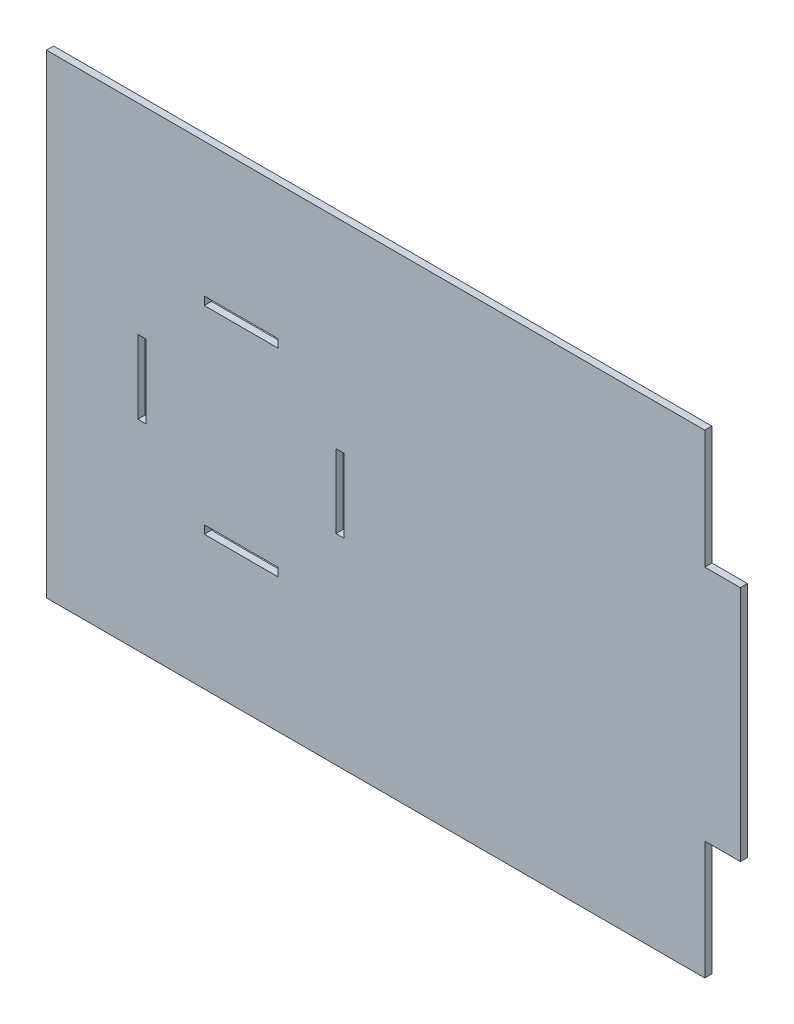
ISO-10303-21;
HEADER;
FILE_DESCRIPTION(('STEP AP214'),'2;1');
FILE_NAME('part.step','',(''),(''),'','','');
FILE_SCHEMA(('AUTOMOTIVE_DESIGN { 1 0 10303 214 1 1 1 1 }'));
ENDSEC;
DATA;
#1=APPLICATION_CONTEXT('core data for automotive mechanical design processes');
#2=APPLICATION_PROTOCOL_DEFINITION('international standard','automotive_design',2000,#1);
#3=PRODUCT_CONTEXT('',#1,'mechanical');
#4=PRODUCT('Part','Part','',(#3));
#5=PRODUCT_RELATED_PRODUCT_CATEGORY('part','',(#4));
#6=PRODUCT_DEFINITION_FORMATION('','',#4);
#7=PRODUCT_DEFINITION_CONTEXT('part definition',#1,'design');
#8=PRODUCT_DEFINITION('design','',#6,#7);
#9=PRODUCT_DEFINITION_SHAPE('','',#8);
#10=(LENGTH_UNIT() NAMED_UNIT(*) SI_UNIT(.MILLI.,.METRE.));
#11=(NAMED_UNIT(*) PLANE_ANGLE_UNIT() SI_UNIT($,.RADIAN.));
#12=(NAMED_UNIT(*) SI_UNIT($,.STERADIAN.) SOLID_ANGLE_UNIT());
#13=UNCERTAINTY_MEASURE_WITH_UNIT(LENGTH_MEASURE(1.E-05),#10,'distance_accuracy_value','');
#14=(GEOMETRIC_REPRESENTATION_CONTEXT(3) GLOBAL_UNCERTAINTY_ASSIGNED_CONTEXT((#13)) GLOBAL_UNIT_ASSIGNED_CONTEXT((#10,
#11,#12)) REPRESENTATION_CONTEXT('',''));
#15=CARTESIAN_POINT('',(0.,0.,0.));
#16=DIRECTION('',(0.,0.,1.));
#17=DIRECTION('',(1.,0.,0.));
#18=AXIS2_PLACEMENT_3D('',#15,#16,#17);
#19=CARTESIAN_POINT('',(-277.5,100.,3.));
#20=DIRECTION('',(0.,-1.,0.));
#21=DIRECTION('',(0.,0.,-1.));
#22=AXIS2_PLACEMENT_3D('',#19,#20,#21);
#23=PLANE('',#22);
#24=DIRECTION('',(-1.,0.,0.));
#25=VECTOR('',#24,1.);
#26=CARTESIAN_POINT('',(-277.5,100.,3.));
#27=LINE('',#26,#25);
#28=CARTESIAN_POINT('',(0.,100.,3.));
#29=VERTEX_POINT('',#28);
#30=CARTESIAN_POINT('',(-277.5,100.,3.));
#31=VERTEX_POINT('',#30);
#32=EDGE_CURVE('E213',#29,#31,#27,.T.);
#33=ORIENTED_EDGE('',*,*,#32,.F.);
#34=DIRECTION('',(0.,0.,1.));
#35=VECTOR('',#34,1.);
#36=CARTESIAN_POINT('',(0.,100.,0.));
#37=LINE('',#36,#35);
#38=CARTESIAN_POINT('',(0.,100.,0.));
#39=VERTEX_POINT('',#38);
#40=EDGE_CURVE('E202',#39,#29,#37,.T.);
#41=ORIENTED_EDGE('',*,*,#40,.F.);
#42=DIRECTION('',(-1.,0.,0.));
#43=VECTOR('',#42,1.);
#44=CARTESIAN_POINT('',(-277.5,100.,0.));
#45=LINE('',#44,#43);
#46=CARTESIAN_POINT('',(-277.5,100.,0.));
#47=VERTEX_POINT('',#46);
#48=EDGE_CURVE('E212',#39,#47,#45,.T.);
#49=ORIENTED_EDGE('',*,*,#48,.T.);
#50=DIRECTION('',(0.,0.,-1.));
#51=VECTOR('',#50,1.);
#52=CARTESIAN_POINT('',(-277.5,100.,3.));
#53=LINE('',#52,#51);
#54=EDGE_CURVE('E11',#31,#47,#53,.T.);
#55=ORIENTED_EDGE('',*,*,#54,.F.);
#56=EDGE_LOOP('',(#33,#41,#49,#55));
#57=FACE_BOUND('',#56,.T.);
#58=ADVANCED_FACE('F39',(#57),#23,.F.);
#59=CARTESIAN_POINT('',(-277.5,-100.,3.));
#60=DIRECTION('',(1.,0.,0.));
#61=DIRECTION('',(0.,0.,-1.));
#62=AXIS2_PLACEMENT_3D('',#59,#60,#61);
#63=PLANE('',#62);
#64=DIRECTION('',(0.,-1.,0.));
#65=VECTOR('',#64,1.);
#66=CARTESIAN_POINT('',(-277.5,-100.,0.));
#67=LINE('',#66,#65);
#68=CARTESIAN_POINT('',(-277.5,-100.,0.));
#69=VERTEX_POINT('',#68);
#70=EDGE_CURVE('E221',#47,#69,#67,.T.);
#71=ORIENTED_EDGE('',*,*,#70,.T.);
#72=DIRECTION('',(0.,0.,-1.));
#73=VECTOR('',#72,1.);
#74=CARTESIAN_POINT('',(-277.5,-100.,3.));
#75=LINE('',#74,#73);
#76=CARTESIAN_POINT('',(-277.5,-100.,3.));
#77=VERTEX_POINT('',#76);
#78=EDGE_CURVE('E46',#77,#69,#75,.T.);
#79=ORIENTED_EDGE('',*,*,#78,.F.);
#80=DIRECTION('',(0.,-1.,0.));
#81=VECTOR('',#80,1.);
#82=CARTESIAN_POINT('',(-277.5,-100.,3.));
#83=LINE('',#82,#81);
#84=EDGE_CURVE('E238',#31,#77,#83,.T.);
#85=ORIENTED_EDGE('',*,*,#84,.F.);
#86=ORIENTED_EDGE('',*,*,#54,.T.);
#87=EDGE_LOOP('',(#71,#79,#85,#86));
#88=FACE_BOUND('',#87,.T.);
#89=ADVANCED_FACE('F410',(#88),#63,.F.);
#90=CARTESIAN_POINT('',(-277.5,-100.,3.));
#91=DIRECTION('',(0.,1.,0.));
#92=DIRECTION('',(0.,0.,1.));
#93=AXIS2_PLACEMENT_3D('',#90,#91,#92);
#94=PLANE('',#93);
#95=DIRECTION('',(1.,0.,0.));
#96=VECTOR('',#95,1.);
#97=CARTESIAN_POINT('',(-277.5,-100.,0.));
#98=LINE('',#97,#96);
#99=CARTESIAN_POINT('',(0.,-100.,0.));
#100=VERTEX_POINT('',#99);
#101=EDGE_CURVE('E224',#69,#100,#98,.T.);
#102=ORIENTED_EDGE('',*,*,#101,.T.);
#103=DIRECTION('',(0.,0.,1.));
#104=VECTOR('',#103,1.);
#105=CARTESIAN_POINT('',(0.,-100.,0.));
#106=LINE('',#105,#104);
#107=CARTESIAN_POINT('',(0.,-100.,3.));
#108=VERTEX_POINT('',#107);
#109=EDGE_CURVE('E333',#100,#108,#106,.T.);
#110=ORIENTED_EDGE('',*,*,#109,.T.);
#111=DIRECTION('',(1.,0.,0.));
#112=VECTOR('',#111,1.);
#113=CARTESIAN_POINT('',(-277.5,-100.,3.));
#114=LINE('',#113,#112);
#115=EDGE_CURVE('E229',#77,#108,#114,.T.);
#116=ORIENTED_EDGE('',*,*,#115,.F.);
#117=ORIENTED_EDGE('',*,*,#78,.T.);
#118=EDGE_LOOP('',(#102,#110,#116,#117));
#119=FACE_BOUND('',#118,.T.);
#120=ADVANCED_FACE('F407',(#119),#94,.F.);
#121=CARTESIAN_POINT('',(0.,0.,3.));
#122=DIRECTION('',(0.,0.,-1.));
#123=DIRECTION('',(-1.,0.,0.));
#124=AXIS2_PLACEMENT_3D('',#121,#122,#123);
#125=PLANE('',#124);
#126=DIRECTION('',(1.,0.,0.));
#127=VECTOR('',#126,1.);
#128=CARTESIAN_POINT('',(-211.,40.,3.));
#129=LINE('',#128,#127);
#130=CARTESIAN_POINT('',(-211.,40.,3.));
#131=VERTEX_POINT('',#130);
#132=CARTESIAN_POINT('',(-180.,40.,3.));
#133=VERTEX_POINT('',#132);
#134=EDGE_CURVE('E322',#131,#133,#129,.T.);
#135=ORIENTED_EDGE('',*,*,#134,.F.);
#136=DIRECTION('',(0.,-1.,0.));
#137=VECTOR('',#136,1.);
#138=CARTESIAN_POINT('',(-211.,43.5,3.));
#139=LINE('',#138,#137);
#140=CARTESIAN_POINT('',(-211.,43.5,3.));
#141=VERTEX_POINT('',#140);
#142=EDGE_CURVE('E61',#141,#131,#139,.T.);
#143=ORIENTED_EDGE('',*,*,#142,.F.);
#144=DIRECTION('',(-1.,0.,0.));
#145=VECTOR('',#144,1.);
#146=CARTESIAN_POINT('',(-211.,43.5,3.));
#147=LINE('',#146,#145);
#148=CARTESIAN_POINT('',(-180.,43.5,3.));
#149=VERTEX_POINT('',#148);
#150=EDGE_CURVE('E309',#149,#141,#147,.T.);
#151=ORIENTED_EDGE('',*,*,#150,.F.);
#152=DIRECTION('',(0.,1.,0.));
#153=VECTOR('',#152,1.);
#154=CARTESIAN_POINT('',(-180.,43.5,3.));
#155=LINE('',#154,#153);
#156=EDGE_CURVE('E325',#133,#149,#155,.T.);
#157=ORIENTED_EDGE('',*,*,#156,.F.);
#158=EDGE_LOOP('',(#135,#143,#151,#157));
#159=FACE_BOUND('',#158,.T.);
#160=DIRECTION('',(-1.,0.,0.));
#161=VECTOR('',#160,1.);
#162=CARTESIAN_POINT('',(-211.,-40.,3.));
#163=LINE('',#162,#161);
#164=CARTESIAN_POINT('',(-180.,-40.,3.));
#165=VERTEX_POINT('',#164);
#166=CARTESIAN_POINT('',(-211.,-40.,3.));
#167=VERTEX_POINT('',#166);
#168=EDGE_CURVE('E353',#165,#167,#163,.T.);
#169=ORIENTED_EDGE('',*,*,#168,.F.);
#170=DIRECTION('',(0.,1.,0.));
#171=VECTOR('',#170,1.);
#172=CARTESIAN_POINT('',(-180.,-43.5,3.));
#173=LINE('',#172,#171);
#174=CARTESIAN_POINT('',(-180.,-43.5,3.));
#175=VERTEX_POINT('',#174);
#176=EDGE_CURVE('E272',#175,#165,#173,.T.);
#177=ORIENTED_EDGE('',*,*,#176,.F.);
#178=DIRECTION('',(1.,0.,0.));
#179=VECTOR('',#178,1.);
#180=CARTESIAN_POINT('',(-211.,-43.5,3.));
#181=LINE('',#180,#179);
#182=CARTESIAN_POINT('',(-211.,-43.5,3.));
#183=VERTEX_POINT('',#182);
#184=EDGE_CURVE('E341',#183,#175,#181,.T.);
#185=ORIENTED_EDGE('',*,*,#184,.F.);
#186=DIRECTION('',(0.,-1.,0.));
#187=VECTOR('',#186,1.);
#188=CARTESIAN_POINT('',(-211.,-43.5,3.));
#189=LINE('',#188,#187);
#190=EDGE_CURVE('E356',#167,#183,#189,.T.);
#191=ORIENTED_EDGE('',*,*,#190,.F.);
#192=EDGE_LOOP('',(#169,#177,#185,#191));
#193=FACE_BOUND('',#192,.T.);
#194=DIRECTION('',(-1.,0.,0.));
#195=VECTOR('',#194,1.);
#196=CARTESIAN_POINT('',(-239.,15.5,3.));
#197=LINE('',#196,#195);
#198=CARTESIAN_POINT('',(-235.5,15.5,3.));
#199=VERTEX_POINT('',#198);
#200=CARTESIAN_POINT('',(-239.,15.5,3.));
#201=VERTEX_POINT('',#200);
#202=EDGE_CURVE('E261',#199,#201,#197,.T.);
#203=ORIENTED_EDGE('',*,*,#202,.F.);
#204=DIRECTION('',(0.,1.,0.));
#205=VECTOR('',#204,1.);
#206=CARTESIAN_POINT('',(-235.5,-15.5,3.));
#207=LINE('',#206,#205);
#208=CARTESIAN_POINT('',(-235.5,-15.5,3.));
#209=VERTEX_POINT('',#208);
#210=EDGE_CURVE('E258',#209,#199,#207,.T.);
#211=ORIENTED_EDGE('',*,*,#210,.F.);
#212=DIRECTION('',(1.,0.,0.));
#213=VECTOR('',#212,1.);
#214=CARTESIAN_POINT('',(-239.,-15.5,3.));
#215=LINE('',#214,#213);
#216=CARTESIAN_POINT('',(-239.,-15.5,3.));
#217=VERTEX_POINT('',#216);
#218=EDGE_CURVE('E247',#217,#209,#215,.T.);
#219=ORIENTED_EDGE('',*,*,#218,.F.);
#220=DIRECTION('',(0.,-1.,0.));
#221=VECTOR('',#220,1.);
#222=CARTESIAN_POINT('',(-239.,-15.5,3.));
#223=LINE('',#222,#221);
#224=EDGE_CURVE('E264',#201,#217,#223,.T.);
#225=ORIENTED_EDGE('',*,*,#224,.F.);
#226=EDGE_LOOP('',(#203,#211,#219,#225));
#227=FACE_BOUND('',#226,.T.);
#228=DIRECTION('',(-1.,0.,0.));
#229=VECTOR('',#228,1.);
#230=CARTESIAN_POINT('',(-155.5,15.4999999999999,3.));
#231=LINE('',#230,#229);
#232=CARTESIAN_POINT('',(-152.,15.4999999999999,3.));
#233=VERTEX_POINT('',#232);
#234=CARTESIAN_POINT('',(-155.5,15.4999999999999,3.));
#235=VERTEX_POINT('',#234);
#236=EDGE_CURVE('E226',#233,#235,#231,.T.);
#237=ORIENTED_EDGE('',*,*,#236,.F.);
#238=DIRECTION('',(0.,1.,0.));
#239=VECTOR('',#238,1.);
#240=CARTESIAN_POINT('',(-152.,-15.5000000000001,3.));
#241=LINE('',#240,#239);
#242=CARTESIAN_POINT('',(-152.,-15.5000000000001,3.));
#243=VERTEX_POINT('',#242);
#244=EDGE_CURVE('E222',#243,#233,#241,.T.);
#245=ORIENTED_EDGE('',*,*,#244,.F.);
#246=DIRECTION('',(1.,0.,0.));
#247=VECTOR('',#246,1.);
#248=CARTESIAN_POINT('',(-155.5,-15.5000000000001,3.));
#249=LINE('',#248,#247);
#250=CARTESIAN_POINT('',(-155.5,-15.5000000000001,3.));
#251=VERTEX_POINT('',#250);
#252=EDGE_CURVE('E281',#251,#243,#249,.T.);
#253=ORIENTED_EDGE('',*,*,#252,.F.);
#254=DIRECTION('',(0.,-1.,0.));
#255=VECTOR('',#254,1.);
#256=CARTESIAN_POINT('',(-155.5,-15.5000000000001,3.));
#257=LINE('',#256,#255);
#258=EDGE_CURVE('E294',#235,#251,#257,.T.);
#259=ORIENTED_EDGE('',*,*,#258,.F.);
#260=EDGE_LOOP('',(#237,#245,#253,#259));
#261=FACE_BOUND('',#260,.T.);
#262=ORIENTED_EDGE('',*,*,#115,.T.);
#263=DIRECTION('',(0.,-1.,0.));
#264=VECTOR('',#263,1.);
#265=CARTESIAN_POINT('',(0.,-50.,3.));
#266=LINE('',#265,#264);
#267=CARTESIAN_POINT('',(0.,-50.,3.));
#268=VERTEX_POINT('',#267);
#269=EDGE_CURVE('E207',#268,#108,#266,.T.);
#270=ORIENTED_EDGE('',*,*,#269,.F.);
#271=DIRECTION('',(-1.,0.,0.));
#272=VECTOR('',#271,1.);
#273=CARTESIAN_POINT('',(0.,-50.,3.));
#274=LINE('',#273,#272);
#275=CARTESIAN_POINT('',(15.,-50.,3.));
#276=VERTEX_POINT('',#275);
#277=EDGE_CURVE('E378',#276,#268,#274,.T.);
#278=ORIENTED_EDGE('',*,*,#277,.F.);
#279=DIRECTION('',(0.,-1.,0.));
#280=VECTOR('',#279,1.);
#281=CARTESIAN_POINT('',(15.,-50.,3.));
#282=LINE('',#281,#280);
#283=CARTESIAN_POINT('',(15.,50.,3.));
#284=VERTEX_POINT('',#283);
#285=EDGE_CURVE('E381',#284,#276,#282,.T.);
#286=ORIENTED_EDGE('',*,*,#285,.F.);
#287=DIRECTION('',(1.,0.,0.));
#288=VECTOR('',#287,1.);
#289=CARTESIAN_POINT('',(15.,50.,3.));
#290=LINE('',#289,#288);
#291=CARTESIAN_POINT('',(0.,50.,3.));
#292=VERTEX_POINT('',#291);
#293=EDGE_CURVE('E384',#292,#284,#290,.T.);
#294=ORIENTED_EDGE('',*,*,#293,.F.);
#295=DIRECTION('',(0.,-1.,0.));
#296=VECTOR('',#295,1.);
#297=CARTESIAN_POINT('',(0.,100.,3.));
#298=LINE('',#297,#296);
#299=EDGE_CURVE('E387',#29,#292,#298,.T.);
#300=ORIENTED_EDGE('',*,*,#299,.F.);
#301=ORIENTED_EDGE('',*,*,#32,.T.);
#302=ORIENTED_EDGE('',*,*,#84,.T.);
#303=EDGE_LOOP('',(#262,#270,#278,#286,#294,#300,#301,#302));
#304=FACE_BOUND('',#303,.T.);
#305=ADVANCED_FACE('F409',(#159,#193,#227,#261,#304),#125,.F.);
#306=CARTESIAN_POINT('',(0.,0.,0.));
#307=DIRECTION('',(0.,0.,-1.));
#308=DIRECTION('',(-1.,0.,0.));
#309=AXIS2_PLACEMENT_3D('',#306,#307,#308);
#310=PLANE('',#309);
#311=DIRECTION('',(0.,-1.,0.));
#312=VECTOR('',#311,1.);
#313=CARTESIAN_POINT('',(0.,-50.,0.));
#314=LINE('',#313,#312);
#315=CARTESIAN_POINT('',(0.,-50.,0.));
#316=VERTEX_POINT('',#315);
#317=EDGE_CURVE('E214',#316,#100,#314,.T.);
#318=ORIENTED_EDGE('',*,*,#317,.T.);
#319=ORIENTED_EDGE('',*,*,#101,.F.);
#320=ORIENTED_EDGE('',*,*,#70,.F.);
#321=ORIENTED_EDGE('',*,*,#48,.F.);
#322=DIRECTION('',(0.,-1.,0.));
#323=VECTOR('',#322,1.);
#324=CARTESIAN_POINT('',(0.,100.,0.));
#325=LINE('',#324,#323);
#326=CARTESIAN_POINT('',(0.,50.,0.));
#327=VERTEX_POINT('',#326);
#328=EDGE_CURVE('E198',#39,#327,#325,.T.);
#329=ORIENTED_EDGE('',*,*,#328,.T.);
#330=DIRECTION('',(1.,0.,0.));
#331=VECTOR('',#330,1.);
#332=CARTESIAN_POINT('',(15.,50.,0.));
#333=LINE('',#332,#331);
#334=CARTESIAN_POINT('',(15.,50.,0.));
#335=VERTEX_POINT('',#334);
#336=EDGE_CURVE('E53',#327,#335,#333,.T.);
#337=ORIENTED_EDGE('',*,*,#336,.T.);
#338=DIRECTION('',(0.,-1.,0.));
#339=VECTOR('',#338,1.);
#340=CARTESIAN_POINT('',(15.,-50.,0.));
#341=LINE('',#340,#339);
#342=CARTESIAN_POINT('',(15.,-50.,0.));
#343=VERTEX_POINT('',#342);
#344=EDGE_CURVE('E393',#335,#343,#341,.T.);
#345=ORIENTED_EDGE('',*,*,#344,.T.);
#346=DIRECTION('',(-1.,0.,0.));
#347=VECTOR('',#346,1.);
#348=CARTESIAN_POINT('',(0.,-50.,0.));
#349=LINE('',#348,#347);
#350=EDGE_CURVE('E390',#343,#316,#349,.T.);
#351=ORIENTED_EDGE('',*,*,#350,.T.);
#352=EDGE_LOOP('',(#318,#319,#320,#321,#329,#337,#345,#351));
#353=FACE_BOUND('',#352,.T.);
#354=DIRECTION('',(0.,-1.,0.));
#355=VECTOR('',#354,1.);
#356=CARTESIAN_POINT('',(-211.,43.5,0.));
#357=LINE('',#356,#355);
#358=CARTESIAN_POINT('',(-211.,43.5,0.));
#359=VERTEX_POINT('',#358);
#360=CARTESIAN_POINT('',(-211.,40.,0.));
#361=VERTEX_POINT('',#360);
#362=EDGE_CURVE('E306',#359,#361,#357,.T.);
#363=ORIENTED_EDGE('',*,*,#362,.T.);
#364=DIRECTION('',(1.,0.,0.));
#365=VECTOR('',#364,1.);
#366=CARTESIAN_POINT('',(-211.,40.,0.));
#367=LINE('',#366,#365);
#368=CARTESIAN_POINT('',(-180.,40.,0.));
#369=VERTEX_POINT('',#368);
#370=EDGE_CURVE('E310',#361,#369,#367,.T.);
#371=ORIENTED_EDGE('',*,*,#370,.T.);
#372=DIRECTION('',(0.,1.,0.));
#373=VECTOR('',#372,1.);
#374=CARTESIAN_POINT('',(-180.,43.5,0.));
#375=LINE('',#374,#373);
#376=CARTESIAN_POINT('',(-180.,43.5,0.));
#377=VERTEX_POINT('',#376);
#378=EDGE_CURVE('E313',#369,#377,#375,.T.);
#379=ORIENTED_EDGE('',*,*,#378,.T.);
#380=DIRECTION('',(-1.,0.,0.));
#381=VECTOR('',#380,1.);
#382=CARTESIAN_POINT('',(-211.,43.5,0.));
#383=LINE('',#382,#381);
#384=EDGE_CURVE('E316',#377,#359,#383,.T.);
#385=ORIENTED_EDGE('',*,*,#384,.T.);
#386=EDGE_LOOP('',(#363,#371,#379,#385));
#387=FACE_BOUND('',#386,.T.);
#388=DIRECTION('',(0.,1.,0.));
#389=VECTOR('',#388,1.);
#390=CARTESIAN_POINT('',(-180.,-43.5,0.));
#391=LINE('',#390,#389);
#392=CARTESIAN_POINT('',(-180.,-43.5,0.));
#393=VERTEX_POINT('',#392);
#394=CARTESIAN_POINT('',(-180.,-40.,0.));
#395=VERTEX_POINT('',#394);
#396=EDGE_CURVE('E338',#393,#395,#391,.T.);
#397=ORIENTED_EDGE('',*,*,#396,.T.);
#398=DIRECTION('',(-1.,0.,0.));
#399=VECTOR('',#398,1.);
#400=CARTESIAN_POINT('',(-211.,-40.,0.));
#401=LINE('',#400,#399);
#402=CARTESIAN_POINT('',(-211.,-40.,0.));
#403=VERTEX_POINT('',#402);
#404=EDGE_CURVE('E342',#395,#403,#401,.T.);
#405=ORIENTED_EDGE('',*,*,#404,.T.);
#406=DIRECTION('',(0.,-1.,0.));
#407=VECTOR('',#406,1.);
#408=CARTESIAN_POINT('',(-211.,-43.5,0.));
#409=LINE('',#408,#407);
#410=CARTESIAN_POINT('',(-211.,-43.5,0.));
#411=VERTEX_POINT('',#410);
#412=EDGE_CURVE('E345',#403,#411,#409,.T.);
#413=ORIENTED_EDGE('',*,*,#412,.T.);
#414=DIRECTION('',(1.,0.,0.));
#415=VECTOR('',#414,1.);
#416=CARTESIAN_POINT('',(-211.,-43.5,0.));
#417=LINE('',#416,#415);
#418=EDGE_CURVE('E348',#411,#393,#417,.T.);
#419=ORIENTED_EDGE('',*,*,#418,.T.);
#420=EDGE_LOOP('',(#397,#405,#413,#419));
#421=FACE_BOUND('',#420,.T.);
#422=DIRECTION('',(0.,1.,0.));
#423=VECTOR('',#422,1.);
#424=CARTESIAN_POINT('',(-235.5,-15.5,0.));
#425=LINE('',#424,#423);
#426=CARTESIAN_POINT('',(-235.5,-15.5,0.));
#427=VERTEX_POINT('',#426);
#428=CARTESIAN_POINT('',(-235.5,15.5,0.));
#429=VERTEX_POINT('',#428);
#430=EDGE_CURVE('E244',#427,#429,#425,.T.);
#431=ORIENTED_EDGE('',*,*,#430,.T.);
#432=DIRECTION('',(-1.,0.,0.));
#433=VECTOR('',#432,1.);
#434=CARTESIAN_POINT('',(-239.,15.5,0.));
#435=LINE('',#434,#433);
#436=CARTESIAN_POINT('',(-239.,15.5,0.));
#437=VERTEX_POINT('',#436);
#438=EDGE_CURVE('E248',#429,#437,#435,.T.);
#439=ORIENTED_EDGE('',*,*,#438,.T.);
#440=DIRECTION('',(0.,-1.,0.));
#441=VECTOR('',#440,1.);
#442=CARTESIAN_POINT('',(-239.,-15.5,0.));
#443=LINE('',#442,#441);
#444=CARTESIAN_POINT('',(-239.,-15.5,0.));
#445=VERTEX_POINT('',#444);
#446=EDGE_CURVE('E251',#437,#445,#443,.T.);
#447=ORIENTED_EDGE('',*,*,#446,.T.);
#448=DIRECTION('',(1.,0.,0.));
#449=VECTOR('',#448,1.);
#450=CARTESIAN_POINT('',(-239.,-15.5,0.));
#451=LINE('',#450,#449);
#452=EDGE_CURVE('E254',#445,#427,#451,.T.);
#453=ORIENTED_EDGE('',*,*,#452,.T.);
#454=EDGE_LOOP('',(#431,#439,#447,#453));
#455=FACE_BOUND('',#454,.T.);
#456=DIRECTION('',(0.,1.,0.));
#457=VECTOR('',#456,1.);
#458=CARTESIAN_POINT('',(-152.,-15.5000000000001,0.));
#459=LINE('',#458,#457);
#460=CARTESIAN_POINT('',(-152.,-15.5000000000001,0.));
#461=VERTEX_POINT('',#460);
#462=CARTESIAN_POINT('',(-152.,15.4999999999999,0.));
#463=VERTEX_POINT('',#462);
#464=EDGE_CURVE('E278',#461,#463,#459,.T.);
#465=ORIENTED_EDGE('',*,*,#464,.T.);
#466=DIRECTION('',(-1.,0.,0.));
#467=VECTOR('',#466,1.);
#468=CARTESIAN_POINT('',(-155.5,15.4999999999999,0.));
#469=LINE('',#468,#467);
#470=CARTESIAN_POINT('',(-155.5,15.4999999999999,0.));
#471=VERTEX_POINT('',#470);
#472=EDGE_CURVE('E282',#463,#471,#469,.T.);
#473=ORIENTED_EDGE('',*,*,#472,.T.);
#474=DIRECTION('',(0.,-1.,0.));
#475=VECTOR('',#474,1.);
#476=CARTESIAN_POINT('',(-155.5,-15.5000000000001,0.));
#477=LINE('',#476,#475);
#478=CARTESIAN_POINT('',(-155.5,-15.5000000000001,0.));
#479=VERTEX_POINT('',#478);
#480=EDGE_CURVE('E285',#471,#479,#477,.T.);
#481=ORIENTED_EDGE('',*,*,#480,.T.);
#482=DIRECTION('',(1.,0.,0.));
#483=VECTOR('',#482,1.);
#484=CARTESIAN_POINT('',(-155.5,-15.5000000000001,0.));
#485=LINE('',#484,#483);
#486=EDGE_CURVE('E288',#479,#461,#485,.T.);
#487=ORIENTED_EDGE('',*,*,#486,.T.);
#488=EDGE_LOOP('',(#465,#473,#481,#487));
#489=FACE_BOUND('',#488,.T.);
#490=ADVANCED_FACE('F218',(#353,#387,#421,#455,#489),#310,.T.);
#491=CARTESIAN_POINT('',(-152.,-15.5000000000001,0.));
#492=DIRECTION('',(1.,0.,0.));
#493=DIRECTION('',(0.,0.,-1.));
#494=AXIS2_PLACEMENT_3D('',#491,#492,#493);
#495=PLANE('',#494);
#496=ORIENTED_EDGE('',*,*,#244,.T.);
#497=DIRECTION('',(0.,0.,1.));
#498=VECTOR('',#497,1.);
#499=CARTESIAN_POINT('',(-152.,15.4999999999999,0.));
#500=LINE('',#499,#498);
#501=EDGE_CURVE('E290',#463,#233,#500,.T.);
#502=ORIENTED_EDGE('',*,*,#501,.F.);
#503=ORIENTED_EDGE('',*,*,#464,.F.);
#504=DIRECTION('',(0.,0.,1.));
#505=VECTOR('',#504,1.);
#506=CARTESIAN_POINT('',(-152.,-15.5000000000001,0.));
#507=LINE('',#506,#505);
#508=EDGE_CURVE('E260',#461,#243,#507,.T.);
#509=ORIENTED_EDGE('',*,*,#508,.T.);
#510=EDGE_LOOP('',(#496,#502,#503,#509));
#511=FACE_BOUND('',#510,.T.);
#512=ADVANCED_FACE('F558',(#511),#495,.F.);
#513=CARTESIAN_POINT('',(-155.5,-15.5000000000001,0.));
#514=DIRECTION('',(0.,-1.,0.));
#515=DIRECTION('',(0.,0.,-1.));
#516=AXIS2_PLACEMENT_3D('',#513,#514,#515);
#517=PLANE('',#516);
#518=ORIENTED_EDGE('',*,*,#252,.T.);
#519=ORIENTED_EDGE('',*,*,#508,.F.);
#520=ORIENTED_EDGE('',*,*,#486,.F.);
#521=DIRECTION('',(0.,0.,1.));
#522=VECTOR('',#521,1.);
#523=CARTESIAN_POINT('',(-155.5,-15.5000000000001,0.));
#524=LINE('',#523,#522);
#525=EDGE_CURVE('E300',#479,#251,#524,.T.);
#526=ORIENTED_EDGE('',*,*,#525,.T.);
#527=EDGE_LOOP('',(#518,#519,#520,#526));
#528=FACE_BOUND('',#527,.T.);
#529=ADVANCED_FACE('F549',(#528),#517,.F.);
#530=CARTESIAN_POINT('',(-155.5,-15.5000000000001,0.));
#531=DIRECTION('',(-1.,0.,0.));
#532=DIRECTION('',(0.,0.,1.));
#533=AXIS2_PLACEMENT_3D('',#530,#531,#532);
#534=PLANE('',#533);
#535=ORIENTED_EDGE('',*,*,#258,.T.);
#536=ORIENTED_EDGE('',*,*,#525,.F.);
#537=ORIENTED_EDGE('',*,*,#480,.F.);
#538=DIRECTION('',(0.,0.,1.));
#539=VECTOR('',#538,1.);
#540=CARTESIAN_POINT('',(-155.5,15.4999999999999,0.));
#541=LINE('',#540,#539);
#542=EDGE_CURVE('E302',#471,#235,#541,.T.);
#543=ORIENTED_EDGE('',*,*,#542,.T.);
#544=EDGE_LOOP('',(#535,#536,#537,#543));
#545=FACE_BOUND('',#544,.T.);
#546=ADVANCED_FACE('F540',(#545),#534,.F.);
#547=CARTESIAN_POINT('',(-155.5,15.4999999999999,0.));
#548=DIRECTION('',(0.,1.,0.));
#549=DIRECTION('',(0.,0.,1.));
#550=AXIS2_PLACEMENT_3D('',#547,#548,#549);
#551=PLANE('',#550);
#552=ORIENTED_EDGE('',*,*,#236,.T.);
#553=ORIENTED_EDGE('',*,*,#542,.F.);
#554=ORIENTED_EDGE('',*,*,#472,.F.);
#555=ORIENTED_EDGE('',*,*,#501,.T.);
#556=EDGE_LOOP('',(#552,#553,#554,#555));
#557=FACE_BOUND('',#556,.T.);
#558=ADVANCED_FACE('F531',(#557),#551,.F.);
#559=CARTESIAN_POINT('',(-235.5,-15.5,0.));
#560=DIRECTION('',(1.,0.,0.));
#561=DIRECTION('',(0.,0.,-1.));
#562=AXIS2_PLACEMENT_3D('',#559,#560,#561);
#563=PLANE('',#562);
#564=ORIENTED_EDGE('',*,*,#210,.T.);
#565=DIRECTION('',(0.,0.,1.));
#566=VECTOR('',#565,1.);
#567=CARTESIAN_POINT('',(-235.5,15.5,0.));
#568=LINE('',#567,#566);
#569=EDGE_CURVE('E257',#429,#199,#568,.T.);
#570=ORIENTED_EDGE('',*,*,#569,.F.);
#571=ORIENTED_EDGE('',*,*,#430,.F.);
#572=DIRECTION('',(0.,0.,1.));
#573=VECTOR('',#572,1.);
#574=CARTESIAN_POINT('',(-235.5,-15.5,0.));
#575=LINE('',#574,#573);
#576=EDGE_CURVE('E269',#427,#209,#575,.T.);
#577=ORIENTED_EDGE('',*,*,#576,.T.);
#578=EDGE_LOOP('',(#564,#570,#571,#577));
#579=FACE_BOUND('',#578,.T.);
#580=ADVANCED_FACE('F522',(#579),#563,.F.);
#581=CARTESIAN_POINT('',(-239.,-15.5,0.));
#582=DIRECTION('',(0.,-1.,0.));
#583=DIRECTION('',(0.,0.,-1.));
#584=AXIS2_PLACEMENT_3D('',#581,#582,#583);
#585=PLANE('',#584);
#586=ORIENTED_EDGE('',*,*,#218,.T.);
#587=ORIENTED_EDGE('',*,*,#576,.F.);
#588=ORIENTED_EDGE('',*,*,#452,.F.);
#589=DIRECTION('',(0.,0.,1.));
#590=VECTOR('',#589,1.);
#591=CARTESIAN_POINT('',(-239.,-15.5,0.));
#592=LINE('',#591,#590);
#593=EDGE_CURVE('E271',#445,#217,#592,.T.);
#594=ORIENTED_EDGE('',*,*,#593,.T.);
#595=EDGE_LOOP('',(#586,#587,#588,#594));
#596=FACE_BOUND('',#595,.T.);
#597=ADVANCED_FACE('F513',(#596),#585,.F.);
#598=CARTESIAN_POINT('',(-239.,-15.5,0.));
#599=DIRECTION('',(-1.,0.,0.));
#600=DIRECTION('',(0.,0.,1.));
#601=AXIS2_PLACEMENT_3D('',#598,#599,#600);
#602=PLANE('',#601);
#603=ORIENTED_EDGE('',*,*,#224,.T.);
#604=ORIENTED_EDGE('',*,*,#593,.F.);
#605=ORIENTED_EDGE('',*,*,#446,.F.);
#606=DIRECTION('',(0.,0.,1.));
#607=VECTOR('',#606,1.);
#608=CARTESIAN_POINT('',(-239.,15.5,0.));
#609=LINE('',#608,#607);
#610=EDGE_CURVE('E274',#437,#201,#609,.T.);
#611=ORIENTED_EDGE('',*,*,#610,.T.);
#612=EDGE_LOOP('',(#603,#604,#605,#611));
#613=FACE_BOUND('',#612,.T.);
#614=ADVANCED_FACE('F504',(#613),#602,.F.);
#615=CARTESIAN_POINT('',(-239.,15.5,0.));
#616=DIRECTION('',(0.,1.,0.));
#617=DIRECTION('',(0.,0.,1.));
#618=AXIS2_PLACEMENT_3D('',#615,#616,#617);
#619=PLANE('',#618);
#620=ORIENTED_EDGE('',*,*,#202,.T.);
#621=ORIENTED_EDGE('',*,*,#610,.F.);
#622=ORIENTED_EDGE('',*,*,#438,.F.);
#623=ORIENTED_EDGE('',*,*,#569,.T.);
#624=EDGE_LOOP('',(#620,#621,#622,#623));
#625=FACE_BOUND('',#624,.T.);
#626=ADVANCED_FACE('F495',(#625),#619,.F.);
#627=CARTESIAN_POINT('',(-180.,-43.5,0.));
#628=DIRECTION('',(1.,0.,0.));
#629=DIRECTION('',(0.,0.,-1.));
#630=AXIS2_PLACEMENT_3D('',#627,#628,#629);
#631=PLANE('',#630);
#632=ORIENTED_EDGE('',*,*,#176,.T.);
#633=DIRECTION('',(0.,0.,1.));
#634=VECTOR('',#633,1.);
#635=CARTESIAN_POINT('',(-180.,-40.,0.));
#636=LINE('',#635,#634);
#637=EDGE_CURVE('E351',#395,#165,#636,.T.);
#638=ORIENTED_EDGE('',*,*,#637,.F.);
#639=ORIENTED_EDGE('',*,*,#396,.F.);
#640=DIRECTION('',(0.,0.,1.));
#641=VECTOR('',#640,1.);
#642=CARTESIAN_POINT('',(-180.,-43.5,0.));
#643=LINE('',#642,#641);
#644=EDGE_CURVE('E321',#393,#175,#643,.T.);
#645=ORIENTED_EDGE('',*,*,#644,.T.);
#646=EDGE_LOOP('',(#632,#638,#639,#645));
#647=FACE_BOUND('',#646,.T.);
#648=ADVANCED_FACE('F486',(#647),#631,.F.);
#649=CARTESIAN_POINT('',(-211.,-43.5,0.));
#650=DIRECTION('',(0.,-1.,0.));
#651=DIRECTION('',(1.,0.,0.));
#652=AXIS2_PLACEMENT_3D('',#649,#650,#651);
#653=PLANE('',#652);
#654=ORIENTED_EDGE('',*,*,#184,.T.);
#655=ORIENTED_EDGE('',*,*,#644,.F.);
#656=ORIENTED_EDGE('',*,*,#418,.F.);
#657=DIRECTION('',(0.,0.,1.));
#658=VECTOR('',#657,1.);
#659=CARTESIAN_POINT('',(-211.,-43.5,0.));
#660=LINE('',#659,#658);
#661=EDGE_CURVE('E362',#411,#183,#660,.T.);
#662=ORIENTED_EDGE('',*,*,#661,.T.);
#663=EDGE_LOOP('',(#654,#655,#656,#662));
#664=FACE_BOUND('',#663,.T.);
#665=ADVANCED_FACE('F477',(#664),#653,.F.);
#666=CARTESIAN_POINT('',(-211.,-43.5,0.));
#667=DIRECTION('',(-1.,0.,0.));
#668=DIRECTION('',(0.,0.,1.));
#669=AXIS2_PLACEMENT_3D('',#666,#667,#668);
#670=PLANE('',#669);
#671=ORIENTED_EDGE('',*,*,#190,.T.);
#672=ORIENTED_EDGE('',*,*,#661,.F.);
#673=ORIENTED_EDGE('',*,*,#412,.F.);
#674=DIRECTION('',(0.,0.,1.));
#675=VECTOR('',#674,1.);
#676=CARTESIAN_POINT('',(-211.,-40.,0.));
#677=LINE('',#676,#675);
#678=EDGE_CURVE('E364',#403,#167,#677,.T.);
#679=ORIENTED_EDGE('',*,*,#678,.T.);
#680=EDGE_LOOP('',(#671,#672,#673,#679));
#681=FACE_BOUND('',#680,.T.);
#682=ADVANCED_FACE('F468',(#681),#670,.F.);
#683=CARTESIAN_POINT('',(-211.,-40.,0.));
#684=DIRECTION('',(0.,1.,0.));
#685=DIRECTION('',(0.,0.,1.));
#686=AXIS2_PLACEMENT_3D('',#683,#684,#685);
#687=PLANE('',#686);
#688=ORIENTED_EDGE('',*,*,#168,.T.);
#689=ORIENTED_EDGE('',*,*,#678,.F.);
#690=ORIENTED_EDGE('',*,*,#404,.F.);
#691=ORIENTED_EDGE('',*,*,#637,.T.);
#692=EDGE_LOOP('',(#688,#689,#690,#691));
#693=FACE_BOUND('',#692,.T.);
#694=ADVANCED_FACE('F460',(#693),#687,.F.);
#695=CARTESIAN_POINT('',(-211.,43.5,0.));
#696=DIRECTION('',(-1.,0.,0.));
#697=DIRECTION('',(0.,0.,1.));
#698=AXIS2_PLACEMENT_3D('',#695,#696,#697);
#699=PLANE('',#698);
#700=ORIENTED_EDGE('',*,*,#142,.T.);
#701=DIRECTION('',(0.,0.,1.));
#702=VECTOR('',#701,1.);
#703=CARTESIAN_POINT('',(-211.,40.,0.));
#704=LINE('',#703,#702);
#705=EDGE_CURVE('E319',#361,#131,#704,.T.);
#706=ORIENTED_EDGE('',*,*,#705,.F.);
#707=ORIENTED_EDGE('',*,*,#362,.F.);
#708=DIRECTION('',(0.,0.,1.));
#709=VECTOR('',#708,1.);
#710=CARTESIAN_POINT('',(-211.,43.5,0.));
#711=LINE('',#710,#709);
#712=EDGE_CURVE('E330',#359,#141,#711,.T.);
#713=ORIENTED_EDGE('',*,*,#712,.T.);
#714=EDGE_LOOP('',(#700,#706,#707,#713));
#715=FACE_BOUND('',#714,.T.);
#716=ADVANCED_FACE('F451',(#715),#699,.F.);
#717=CARTESIAN_POINT('',(-211.,43.5,0.));
#718=DIRECTION('',(0.,1.,0.));
#719=DIRECTION('',(-1.,0.,0.));
#720=AXIS2_PLACEMENT_3D('',#717,#718,#719);
#721=PLANE('',#720);
#722=ORIENTED_EDGE('',*,*,#150,.T.);
#723=ORIENTED_EDGE('',*,*,#712,.F.);
#724=ORIENTED_EDGE('',*,*,#384,.F.);
#725=DIRECTION('',(0.,0.,1.));
#726=VECTOR('',#725,1.);
#727=CARTESIAN_POINT('',(-180.,43.5,0.));
#728=LINE('',#727,#726);
#729=EDGE_CURVE('E332',#377,#149,#728,.T.);
#730=ORIENTED_EDGE('',*,*,#729,.T.);
#731=EDGE_LOOP('',(#722,#723,#724,#730));
#732=FACE_BOUND('',#731,.T.);
#733=ADVANCED_FACE('F442',(#732),#721,.F.);
#734=CARTESIAN_POINT('',(-180.,43.5,0.));
#735=DIRECTION('',(1.,0.,0.));
#736=DIRECTION('',(0.,0.,-1.));
#737=AXIS2_PLACEMENT_3D('',#734,#735,#736);
#738=PLANE('',#737);
#739=ORIENTED_EDGE('',*,*,#156,.T.);
#740=ORIENTED_EDGE('',*,*,#729,.F.);
#741=ORIENTED_EDGE('',*,*,#378,.F.);
#742=DIRECTION('',(0.,0.,1.));
#743=VECTOR('',#742,1.);
#744=CARTESIAN_POINT('',(-180.,40.,0.));
#745=LINE('',#744,#743);
#746=EDGE_CURVE('E335',#369,#133,#745,.T.);
#747=ORIENTED_EDGE('',*,*,#746,.T.);
#748=EDGE_LOOP('',(#739,#740,#741,#747));
#749=FACE_BOUND('',#748,.T.);
#750=ADVANCED_FACE('F432',(#749),#738,.F.);
#751=CARTESIAN_POINT('',(-211.,40.,0.));
#752=DIRECTION('',(0.,-1.,0.));
#753=DIRECTION('',(0.,0.,-1.));
#754=AXIS2_PLACEMENT_3D('',#751,#752,#753);
#755=PLANE('',#754);
#756=ORIENTED_EDGE('',*,*,#134,.T.);
#757=ORIENTED_EDGE('',*,*,#746,.F.);
#758=ORIENTED_EDGE('',*,*,#370,.F.);
#759=ORIENTED_EDGE('',*,*,#705,.T.);
#760=EDGE_LOOP('',(#756,#757,#758,#759));
#761=FACE_BOUND('',#760,.T.);
#762=ADVANCED_FACE('F428',(#761),#755,.F.);
#763=CARTESIAN_POINT('',(0.,-50.,0.));
#764=DIRECTION('',(-1.,0.,0.));
#765=DIRECTION('',(0.,-1.,0.));
#766=AXIS2_PLACEMENT_3D('',#763,#764,#765);
#767=PLANE('',#766);
#768=ORIENTED_EDGE('',*,*,#269,.T.);
#769=ORIENTED_EDGE('',*,*,#109,.F.);
#770=ORIENTED_EDGE('',*,*,#317,.F.);
#771=DIRECTION('',(0.,0.,1.));
#772=VECTOR('',#771,1.);
#773=CARTESIAN_POINT('',(0.,-50.,0.));
#774=LINE('',#773,#772);
#775=EDGE_CURVE('E373',#316,#268,#774,.T.);
#776=ORIENTED_EDGE('',*,*,#775,.T.);
#777=EDGE_LOOP('',(#768,#769,#770,#776));
#778=FACE_BOUND('',#777,.T.);
#779=ADVANCED_FACE('F406',(#778),#767,.F.);
#780=CARTESIAN_POINT('',(0.,-50.,0.));
#781=DIRECTION('',(0.,1.,0.));
#782=DIRECTION('',(-1.,0.,0.));
#783=AXIS2_PLACEMENT_3D('',#780,#781,#782);
#784=PLANE('',#783);
#785=ORIENTED_EDGE('',*,*,#277,.T.);
#786=ORIENTED_EDGE('',*,*,#775,.F.);
#787=ORIENTED_EDGE('',*,*,#350,.F.);
#788=DIRECTION('',(0.,0.,1.));
#789=VECTOR('',#788,1.);
#790=CARTESIAN_POINT('',(15.,-50.,0.));
#791=LINE('',#790,#789);
#792=EDGE_CURVE('E371',#343,#276,#791,.T.);
#793=ORIENTED_EDGE('',*,*,#792,.T.);
#794=EDGE_LOOP('',(#785,#786,#787,#793));
#795=FACE_BOUND('',#794,.T.);
#796=ADVANCED_FACE('F403',(#795),#784,.F.);
#797=CARTESIAN_POINT('',(15.,-50.,0.));
#798=DIRECTION('',(-1.,0.,0.));
#799=DIRECTION('',(0.,-1.,0.));
#800=AXIS2_PLACEMENT_3D('',#797,#798,#799);
#801=PLANE('',#800);
#802=ORIENTED_EDGE('',*,*,#285,.T.);
#803=ORIENTED_EDGE('',*,*,#792,.F.);
#804=ORIENTED_EDGE('',*,*,#344,.F.);
#805=DIRECTION('',(0.,0.,1.));
#806=VECTOR('',#805,1.);
#807=CARTESIAN_POINT('',(15.,50.,0.));
#808=LINE('',#807,#806);
#809=EDGE_CURVE('E369',#335,#284,#808,.T.);
#810=ORIENTED_EDGE('',*,*,#809,.T.);
#811=EDGE_LOOP('',(#802,#803,#804,#810));
#812=FACE_BOUND('',#811,.T.);
#813=ADVANCED_FACE('F399',(#812),#801,.F.);
#814=CARTESIAN_POINT('',(15.,50.,0.));
#815=DIRECTION('',(0.,-1.,0.));
#816=DIRECTION('',(1.,0.,0.));
#817=AXIS2_PLACEMENT_3D('',#814,#815,#816);
#818=PLANE('',#817);
#819=ORIENTED_EDGE('',*,*,#293,.T.);
#820=ORIENTED_EDGE('',*,*,#809,.F.);
#821=ORIENTED_EDGE('',*,*,#336,.F.);
#822=DIRECTION('',(0.,0.,1.));
#823=VECTOR('',#822,1.);
#824=CARTESIAN_POINT('',(0.,50.,0.));
#825=LINE('',#824,#823);
#826=EDGE_CURVE('E204',#327,#292,#825,.T.);
#827=ORIENTED_EDGE('',*,*,#826,.T.);
#828=EDGE_LOOP('',(#819,#820,#821,#827));
#829=FACE_BOUND('',#828,.T.);
#830=ADVANCED_FACE('F610',(#829),#818,.F.);
#831=CARTESIAN_POINT('',(0.,100.,0.));
#832=DIRECTION('',(-1.,0.,0.));
#833=DIRECTION('',(0.,-1.,0.));
#834=AXIS2_PLACEMENT_3D('',#831,#832,#833);
#835=PLANE('',#834);
#836=ORIENTED_EDGE('',*,*,#299,.T.);
#837=ORIENTED_EDGE('',*,*,#826,.F.);
#838=ORIENTED_EDGE('',*,*,#328,.F.);
#839=ORIENTED_EDGE('',*,*,#40,.T.);
#840=EDGE_LOOP('',(#836,#837,#838,#839));
#841=FACE_BOUND('',#840,.T.);
#842=ADVANCED_FACE('F201',(#841),#835,.F.);
#843=CLOSED_SHELL('',(#58,#89,#120,#305,#490,#512,#529,#546,#558,#580,#597,#614,#626,#648,#665,
#682,#694,#716,#733,#750,#762,#779,#796,#813,#830,#842));
#844=MANIFOLD_SOLID_BREP('B2',#843);
#845=ADVANCED_BREP_SHAPE_REPRESENTATION('',(#18,#844),#14);
#846=SHAPE_DEFINITION_REPRESENTATION(#9,#845);
ENDSEC;
END-ISO-10303-21;
